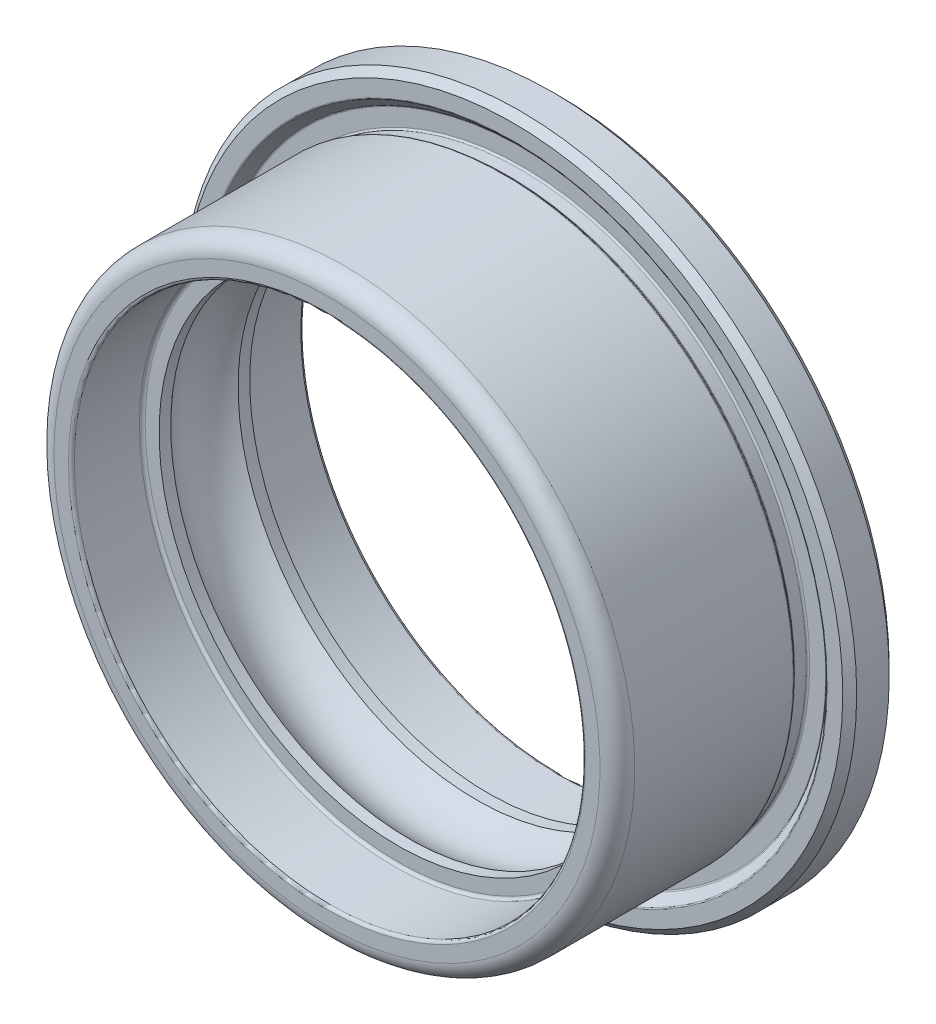
ISO-10303-21;
HEADER;
FILE_DESCRIPTION(('STEP AP214'),'2;1');
FILE_NAME('part.step','',(''),(''),'','','');
FILE_SCHEMA(('AUTOMOTIVE_DESIGN { 1 0 10303 214 1 1 1 1 }'));
ENDSEC;
DATA;
#1=APPLICATION_CONTEXT('core data for automotive mechanical design processes');
#2=APPLICATION_PROTOCOL_DEFINITION('international standard','automotive_design',2000,#1);
#3=PRODUCT_CONTEXT('',#1,'mechanical');
#4=PRODUCT('Part','Part','',(#3));
#5=PRODUCT_RELATED_PRODUCT_CATEGORY('part','',(#4));
#6=PRODUCT_DEFINITION_FORMATION('','',#4);
#7=PRODUCT_DEFINITION_CONTEXT('part definition',#1,'design');
#8=PRODUCT_DEFINITION('design','',#6,#7);
#9=PRODUCT_DEFINITION_SHAPE('','',#8);
#10=(LENGTH_UNIT() NAMED_UNIT(*) SI_UNIT(.MILLI.,.METRE.));
#11=(NAMED_UNIT(*) PLANE_ANGLE_UNIT() SI_UNIT($,.RADIAN.));
#12=(NAMED_UNIT(*) SI_UNIT($,.STERADIAN.) SOLID_ANGLE_UNIT());
#13=UNCERTAINTY_MEASURE_WITH_UNIT(LENGTH_MEASURE(1.E-05),#10,'distance_accuracy_value','');
#14=(GEOMETRIC_REPRESENTATION_CONTEXT(3) GLOBAL_UNCERTAINTY_ASSIGNED_CONTEXT((#13)) GLOBAL_UNIT_ASSIGNED_CONTEXT((#10,
#11,#12)) REPRESENTATION_CONTEXT('',''));
#15=CARTESIAN_POINT('',(0.,0.,0.));
#16=DIRECTION('',(0.,0.,1.));
#17=DIRECTION('',(1.,0.,0.));
#18=AXIS2_PLACEMENT_3D('',#15,#16,#17);
#19=CARTESIAN_POINT('',(0.,0.,2.));
#20=DIRECTION('',(0.,0.,1.));
#21=DIRECTION('',(1.,0.,0.));
#22=AXIS2_PLACEMENT_3D('',#19,#20,#21);
#23=CYLINDRICAL_SURFACE('',#22,5.);
#24=CARTESIAN_POINT('',(0.,0.,-1.02757359312881));
#25=DIRECTION('',(0.,0.,-1.));
#26=DIRECTION('',(-1.,0.,0.));
#27=AXIS2_PLACEMENT_3D('',#24,#25,#26);
#28=CIRCLE('',#27,5.);
#29=CARTESIAN_POINT('',(-5.,0.,-1.02757359312881));
#30=VERTEX_POINT('',#29);
#31=EDGE_CURVE('E77',#30,#30,#28,.F.);
#32=ORIENTED_EDGE('',*,*,#31,.T.);
#33=EDGE_LOOP('',(#32));
#34=FACE_BOUND('',#33,.T.);
#35=CARTESIAN_POINT('',(0.,0.,1.7));
#36=DIRECTION('',(0.,0.,-1.));
#37=DIRECTION('',(-1.,0.,0.));
#38=AXIS2_PLACEMENT_3D('',#35,#36,#37);
#39=CIRCLE('',#38,5.);
#40=CARTESIAN_POINT('',(-5.,0.,1.7));
#41=VERTEX_POINT('',#40);
#42=EDGE_CURVE('E113',#41,#41,#39,.T.);
#43=ORIENTED_EDGE('',*,*,#42,.T.);
#44=EDGE_LOOP('',(#43));
#45=FACE_BOUND('',#44,.T.);
#46=ADVANCED_FACE('F39',(#34,#45),#23,.T.);
#47=CARTESIAN_POINT('',(0.,0.,2.));
#48=DIRECTION('',(0.,0.,1.));
#49=DIRECTION('',(1.,0.,0.));
#50=AXIS2_PLACEMENT_3D('',#47,#48,#49);
#51=CYLINDRICAL_SURFACE('',#50,4.4);
#52=CARTESIAN_POINT('',(0.,0.,1.95));
#53=DIRECTION('',(0.,0.,-1.));
#54=DIRECTION('',(-1.,0.,0.));
#55=AXIS2_PLACEMENT_3D('',#52,#53,#54);
#56=CIRCLE('',#55,4.4);
#57=CARTESIAN_POINT('',(-4.4,0.,1.95));
#58=VERTEX_POINT('',#57);
#59=EDGE_CURVE('E95',#58,#58,#56,.F.);
#60=ORIENTED_EDGE('',*,*,#59,.T.);
#61=EDGE_LOOP('',(#60));
#62=FACE_BOUND('',#61,.T.);
#63=CARTESIAN_POINT('',(0.,0.,0.829992845424422));
#64=DIRECTION('',(0.,0.,-1.));
#65=DIRECTION('',(-1.,0.,0.));
#66=AXIS2_PLACEMENT_3D('',#63,#64,#65);
#67=CIRCLE('',#66,4.4);
#68=CARTESIAN_POINT('',(-4.4,0.,0.829992845424422));
#69=VERTEX_POINT('',#68);
#70=EDGE_CURVE('E98',#69,#69,#67,.T.);
#71=ORIENTED_EDGE('',*,*,#70,.T.);
#72=EDGE_LOOP('',(#71));
#73=FACE_BOUND('',#72,.T.);
#74=ADVANCED_FACE('F154',(#62,#73),#51,.F.);
#75=CARTESIAN_POINT('',(0.,4.4,0.779992845424422));
#76=DIRECTION('',(0.,0.,-1.));
#77=DIRECTION('',(-1.,0.,0.));
#78=AXIS2_PLACEMENT_3D('',#75,#76,#77);
#79=PLANE('',#78);
#80=CARTESIAN_POINT('',(0.,0.,0.779992845424422));
#81=DIRECTION('',(0.,0.,-1.));
#82=DIRECTION('',(-1.,0.,0.));
#83=AXIS2_PLACEMENT_3D('',#80,#81,#82);
#84=CIRCLE('',#83,4.35);
#85=CARTESIAN_POINT('',(-4.35,0.,0.779992845424422));
#86=VERTEX_POINT('',#85);
#87=EDGE_CURVE('E89',#86,#86,#84,.F.);
#88=ORIENTED_EDGE('',*,*,#87,.T.);
#89=EDGE_LOOP('',(#88));
#90=FACE_BOUND('',#89,.T.);
#91=CARTESIAN_POINT('',(0.,0.,0.779992845424422));
#92=DIRECTION('',(0.,0.,1.));
#93=DIRECTION('',(1.,0.,0.));
#94=AXIS2_PLACEMENT_3D('',#91,#92,#93);
#95=CIRCLE('',#94,4.11);
#96=CARTESIAN_POINT('',(4.11,0.,0.779992845424422));
#97=VERTEX_POINT('',#96);
#98=EDGE_CURVE('E119',#97,#97,#95,.T.);
#99=ORIENTED_EDGE('',*,*,#98,.F.);
#100=EDGE_LOOP('',(#99));
#101=FACE_BOUND('',#100,.T.);
#102=ADVANCED_FACE('F149',(#90,#101),#79,.F.);
#103=CARTESIAN_POINT('',(0.,0.,2.));
#104=DIRECTION('',(0.,0.,1.));
#105=DIRECTION('',(1.,0.,0.));
#106=AXIS2_PLACEMENT_3D('',#103,#104,#105);
#107=CYLINDRICAL_SURFACE('',#106,4.11);
#108=CARTESIAN_POINT('',(0.,0.,0.579992845424422));
#109=DIRECTION('',(0.,0.,1.));
#110=DIRECTION('',(1.,0.,0.));
#111=AXIS2_PLACEMENT_3D('',#108,#109,#110);
#112=CIRCLE('',#111,4.11);
#113=CARTESIAN_POINT('',(4.11,0.,0.579992845424422));
#114=VERTEX_POINT('',#113);
#115=EDGE_CURVE('E122',#114,#114,#112,.T.);
#116=ORIENTED_EDGE('',*,*,#115,.F.);
#117=EDGE_LOOP('',(#116));
#118=FACE_BOUND('',#117,.T.);
#119=ORIENTED_EDGE('',*,*,#98,.T.);
#120=EDGE_LOOP('',(#119));
#121=FACE_BOUND('',#120,.T.);
#122=ADVANCED_FACE('F143',(#118,#121),#107,.F.);
#123=CARTESIAN_POINT('',(0.,0.,0.));
#124=DIRECTION('',(0.,0.,1.));
#125=DIRECTION('',(1.,0.,0.));
#126=AXIS2_PLACEMENT_3D('',#123,#124,#125);
#127=TOROIDAL_SURFACE('',#126,3.52469298717982,0.824);
#128=CARTESIAN_POINT('',(0.,0.,-0.579992845424423));
#129=DIRECTION('',(0.,0.,1.));
#130=DIRECTION('',(1.,0.,0.));
#131=AXIS2_PLACEMENT_3D('',#128,#129,#130);
#132=CIRCLE('',#131,4.11);
#133=CARTESIAN_POINT('',(4.11,0.,-0.579992845424423));
#134=VERTEX_POINT('',#133);
#135=EDGE_CURVE('E125',#134,#134,#132,.T.);
#136=ORIENTED_EDGE('',*,*,#135,.F.);
#137=EDGE_LOOP('',(#136));
#138=FACE_BOUND('',#137,.T.);
#139=ORIENTED_EDGE('',*,*,#115,.T.);
#140=EDGE_LOOP('',(#139));
#141=FACE_BOUND('',#140,.T.);
#142=ADVANCED_FACE('F137',(#138,#141),#127,.F.);
#143=CARTESIAN_POINT('',(0.,0.,2.));
#144=DIRECTION('',(0.,0.,1.));
#145=DIRECTION('',(1.,0.,0.));
#146=AXIS2_PLACEMENT_3D('',#143,#144,#145);
#147=CYLINDRICAL_SURFACE('',#146,4.11);
#148=CARTESIAN_POINT('',(0.,0.,-0.779992845424422));
#149=DIRECTION('',(0.,0.,1.));
#150=DIRECTION('',(1.,0.,0.));
#151=AXIS2_PLACEMENT_3D('',#148,#149,#150);
#152=CIRCLE('',#151,4.11);
#153=CARTESIAN_POINT('',(4.11,0.,-0.779992845424422));
#154=VERTEX_POINT('',#153);
#155=EDGE_CURVE('E128',#154,#154,#152,.T.);
#156=ORIENTED_EDGE('',*,*,#155,.F.);
#157=EDGE_LOOP('',(#156));
#158=FACE_BOUND('',#157,.T.);
#159=ORIENTED_EDGE('',*,*,#135,.T.);
#160=EDGE_LOOP('',(#159));
#161=FACE_BOUND('',#160,.T.);
#162=ADVANCED_FACE('F134',(#158,#161),#147,.F.);
#163=CARTESIAN_POINT('',(0.,4.4,-0.779992845424422));
#164=DIRECTION('',(0.,0.,1.));
#165=DIRECTION('',(1.,0.,0.));
#166=AXIS2_PLACEMENT_3D('',#163,#164,#165);
#167=PLANE('',#166);
#168=CARTESIAN_POINT('',(0.,0.,-0.779992845424422));
#169=DIRECTION('',(0.,0.,1.));
#170=DIRECTION('',(1.,0.,0.));
#171=AXIS2_PLACEMENT_3D('',#168,#169,#170);
#172=CIRCLE('',#171,4.35);
#173=CARTESIAN_POINT('',(4.35,0.,-0.779992845424422));
#174=VERTEX_POINT('',#173);
#175=EDGE_CURVE('E101',#174,#174,#172,.F.);
#176=ORIENTED_EDGE('',*,*,#175,.T.);
#177=EDGE_LOOP('',(#176));
#178=FACE_BOUND('',#177,.T.);
#179=ORIENTED_EDGE('',*,*,#155,.T.);
#180=EDGE_LOOP('',(#179));
#181=FACE_BOUND('',#180,.T.);
#182=ADVANCED_FACE('F132',(#178,#181),#167,.F.);
#183=CARTESIAN_POINT('',(0.,0.,2.));
#184=DIRECTION('',(0.,0.,1.));
#185=DIRECTION('',(1.,0.,0.));
#186=AXIS2_PLACEMENT_3D('',#183,#184,#185);
#187=CYLINDRICAL_SURFACE('',#186,4.4);
#188=CARTESIAN_POINT('',(0.,0.,-1.95));
#189=DIRECTION('',(0.,0.,1.));
#190=DIRECTION('',(1.,0.,0.));
#191=AXIS2_PLACEMENT_3D('',#188,#189,#190);
#192=CIRCLE('',#191,4.4);
#193=CARTESIAN_POINT('',(4.4,0.,-1.95));
#194=VERTEX_POINT('',#193);
#195=EDGE_CURVE('E104',#194,#194,#192,.F.);
#196=ORIENTED_EDGE('',*,*,#195,.T.);
#197=EDGE_LOOP('',(#196));
#198=FACE_BOUND('',#197,.T.);
#199=CARTESIAN_POINT('',(0.,0.,-0.829992845424422));
#200=DIRECTION('',(0.,0.,1.));
#201=DIRECTION('',(1.,0.,0.));
#202=AXIS2_PLACEMENT_3D('',#199,#200,#201);
#203=CIRCLE('',#202,4.4);
#204=CARTESIAN_POINT('',(4.4,0.,-0.829992845424422));
#205=VERTEX_POINT('',#204);
#206=EDGE_CURVE('E107',#205,#205,#203,.T.);
#207=ORIENTED_EDGE('',*,*,#206,.T.);
#208=EDGE_LOOP('',(#207));
#209=FACE_BOUND('',#208,.T.);
#210=ADVANCED_FACE('F177',(#198,#209),#187,.F.);
#211=CARTESIAN_POINT('',(0.,5.,-2.));
#212=DIRECTION('',(0.,0.,1.));
#213=DIRECTION('',(1.,0.,0.));
#214=AXIS2_PLACEMENT_3D('',#211,#212,#213);
#215=PLANE('',#214);
#216=CARTESIAN_POINT('',(0.,0.,-2.));
#217=DIRECTION('',(0.,0.,1.));
#218=DIRECTION('',(1.,0.,0.));
#219=AXIS2_PLACEMENT_3D('',#216,#217,#218);
#220=CIRCLE('',#219,5.68);
#221=CARTESIAN_POINT('',(5.68,0.,-2.));
#222=VERTEX_POINT('',#221);
#223=EDGE_CURVE('E54',#222,#222,#220,.F.);
#224=ORIENTED_EDGE('',*,*,#223,.T.);
#225=EDGE_LOOP('',(#224));
#226=FACE_BOUND('',#225,.T.);
#227=CARTESIAN_POINT('',(0.,0.,-2.));
#228=DIRECTION('',(0.,0.,1.));
#229=DIRECTION('',(1.,0.,0.));
#230=AXIS2_PLACEMENT_3D('',#227,#228,#229);
#231=CIRCLE('',#230,4.45);
#232=CARTESIAN_POINT('',(4.45,0.,-2.));
#233=VERTEX_POINT('',#232);
#234=EDGE_CURVE('E110',#233,#233,#231,.T.);
#235=ORIENTED_EDGE('',*,*,#234,.T.);
#236=EDGE_LOOP('',(#235));
#237=FACE_BOUND('',#236,.T.);
#238=ADVANCED_FACE('F174',(#226,#237),#215,.F.);
#239=CARTESIAN_POINT('',(0.,5.,2.));
#240=DIRECTION('',(0.,0.,-1.));
#241=DIRECTION('',(-1.,0.,0.));
#242=AXIS2_PLACEMENT_3D('',#239,#240,#241);
#243=PLANE('',#242);
#244=CARTESIAN_POINT('',(0.,0.,2.));
#245=DIRECTION('',(0.,0.,-1.));
#246=DIRECTION('',(-1.,0.,0.));
#247=AXIS2_PLACEMENT_3D('',#244,#245,#246);
#248=CIRCLE('',#247,4.45);
#249=CARTESIAN_POINT('',(-4.45,0.,2.));
#250=VERTEX_POINT('',#249);
#251=EDGE_CURVE('E92',#250,#250,#248,.T.);
#252=ORIENTED_EDGE('',*,*,#251,.T.);
#253=EDGE_LOOP('',(#252));
#254=FACE_BOUND('',#253,.T.);
#255=CARTESIAN_POINT('',(0.,0.,2.));
#256=DIRECTION('',(0.,0.,-1.));
#257=DIRECTION('',(-1.,0.,0.));
#258=AXIS2_PLACEMENT_3D('',#255,#256,#257);
#259=CIRCLE('',#258,4.7);
#260=CARTESIAN_POINT('',(-4.7,0.,2.));
#261=VERTEX_POINT('',#260);
#262=EDGE_CURVE('E116',#261,#261,#259,.F.);
#263=ORIENTED_EDGE('',*,*,#262,.T.);
#264=EDGE_LOOP('',(#263));
#265=FACE_BOUND('',#264,.T.);
#266=ADVANCED_FACE('F172',(#254,#265),#243,.F.);
#267=CARTESIAN_POINT('',(0.,5.8,-1.2));
#268=DIRECTION('',(0.,0.,1.));
#269=DIRECTION('',(1.,0.,0.));
#270=AXIS2_PLACEMENT_3D('',#267,#268,#269);
#271=PLANE('',#270);
#272=CARTESIAN_POINT('',(0.,0.,-1.2));
#273=DIRECTION('',(0.,0.,1.));
#274=DIRECTION('',(1.,0.,0.));
#275=AXIS2_PLACEMENT_3D('',#272,#273,#274);
#276=CIRCLE('',#275,5.68);
#277=CARTESIAN_POINT('',(5.68,0.,-1.2));
#278=VERTEX_POINT('',#277);
#279=EDGE_CURVE('E10',#278,#278,#276,.T.);
#280=ORIENTED_EDGE('',*,*,#279,.T.);
#281=EDGE_LOOP('',(#280));
#282=FACE_BOUND('',#281,.T.);
#283=CARTESIAN_POINT('',(0.,0.,-1.2));
#284=DIRECTION('',(0.,0.,1.));
#285=DIRECTION('',(1.,0.,0.));
#286=AXIS2_PLACEMENT_3D('',#283,#284,#285);
#287=CIRCLE('',#286,5.41242640687119);
#288=CARTESIAN_POINT('',(5.41242640687119,0.,-1.2));
#289=VERTEX_POINT('',#288);
#290=EDGE_CURVE('E80',#289,#289,#287,.F.);
#291=ORIENTED_EDGE('',*,*,#290,.T.);
#292=EDGE_LOOP('',(#291));
#293=FACE_BOUND('',#292,.T.);
#294=ADVANCED_FACE('F255',(#282,#293),#271,.T.);
#295=CARTESIAN_POINT('',(0.,0.,-2.));
#296=DIRECTION('',(0.,0.,-1.));
#297=DIRECTION('',(-1.,0.,0.));
#298=AXIS2_PLACEMENT_3D('',#295,#296,#297);
#299=CYLINDRICAL_SURFACE('',#298,5.8);
#300=CARTESIAN_POINT('',(0.,0.,-1.88));
#301=DIRECTION('',(0.,0.,1.));
#302=DIRECTION('',(1.,0.,0.));
#303=AXIS2_PLACEMENT_3D('',#300,#301,#302);
#304=CIRCLE('',#303,5.8);
#305=CARTESIAN_POINT('',(5.8,0.,-1.88));
#306=VERTEX_POINT('',#305);
#307=EDGE_CURVE('E46',#306,#306,#304,.T.);
#308=ORIENTED_EDGE('',*,*,#307,.T.);
#309=EDGE_LOOP('',(#308));
#310=FACE_BOUND('',#309,.T.);
#311=CARTESIAN_POINT('',(0.,0.,-1.32));
#312=DIRECTION('',(0.,0.,1.));
#313=DIRECTION('',(1.,0.,0.));
#314=AXIS2_PLACEMENT_3D('',#311,#312,#313);
#315=CIRCLE('',#314,5.8);
#316=CARTESIAN_POINT('',(5.8,0.,-1.32));
#317=VERTEX_POINT('',#316);
#318=EDGE_CURVE('E50',#317,#317,#315,.F.);
#319=ORIENTED_EDGE('',*,*,#318,.T.);
#320=EDGE_LOOP('',(#319));
#321=FACE_BOUND('',#320,.T.);
#322=ADVANCED_FACE('F253',(#310,#321),#299,.T.);
#323=CARTESIAN_POINT('',(0.,0.,1.7));
#324=DIRECTION('',(0.,0.,-1.));
#325=DIRECTION('',(-1.,0.,0.));
#326=AXIS2_PLACEMENT_3D('',#323,#324,#325);
#327=TOROIDAL_SURFACE('',#326,4.7,0.3);
#328=ORIENTED_EDGE('',*,*,#42,.F.);
#329=EDGE_LOOP('',(#328));
#330=FACE_BOUND('',#329,.T.);
#331=ORIENTED_EDGE('',*,*,#262,.F.);
#332=EDGE_LOOP('',(#331));
#333=FACE_BOUND('',#332,.T.);
#334=ADVANCED_FACE('F205',(#330,#333),#327,.T.);
#335=CARTESIAN_POINT('',(0.,0.,-1.95));
#336=DIRECTION('',(0.,0.,1.));
#337=DIRECTION('',(1.,0.,0.));
#338=AXIS2_PLACEMENT_3D('',#335,#336,#337);
#339=TOROIDAL_SURFACE('',#338,4.45,0.05);
#340=ORIENTED_EDGE('',*,*,#195,.F.);
#341=EDGE_LOOP('',(#340));
#342=FACE_BOUND('',#341,.T.);
#343=ORIENTED_EDGE('',*,*,#234,.F.);
#344=EDGE_LOOP('',(#343));
#345=FACE_BOUND('',#344,.T.);
#346=ADVANCED_FACE('F193',(#342,#345),#339,.T.);
#347=CARTESIAN_POINT('',(0.,0.,-0.829992845424422));
#348=DIRECTION('',(0.,0.,1.));
#349=DIRECTION('',(1.,0.,0.));
#350=AXIS2_PLACEMENT_3D('',#347,#348,#349);
#351=TOROIDAL_SURFACE('',#350,4.35,0.05);
#352=ORIENTED_EDGE('',*,*,#175,.F.);
#353=EDGE_LOOP('',(#352));
#354=FACE_BOUND('',#353,.T.);
#355=ORIENTED_EDGE('',*,*,#206,.F.);
#356=EDGE_LOOP('',(#355));
#357=FACE_BOUND('',#356,.T.);
#358=ADVANCED_FACE('F189',(#354,#357),#351,.F.);
#359=CARTESIAN_POINT('',(0.,0.,1.95));
#360=DIRECTION('',(0.,0.,-1.));
#361=DIRECTION('',(-1.,0.,0.));
#362=AXIS2_PLACEMENT_3D('',#359,#360,#361);
#363=TOROIDAL_SURFACE('',#362,4.45,0.05);
#364=ORIENTED_EDGE('',*,*,#251,.F.);
#365=EDGE_LOOP('',(#364));
#366=FACE_BOUND('',#365,.T.);
#367=ORIENTED_EDGE('',*,*,#59,.F.);
#368=EDGE_LOOP('',(#367));
#369=FACE_BOUND('',#368,.T.);
#370=ADVANCED_FACE('F192',(#366,#369),#363,.T.);
#371=CARTESIAN_POINT('',(0.,0.,0.829992845424422));
#372=DIRECTION('',(0.,0.,-1.));
#373=DIRECTION('',(-1.,0.,0.));
#374=AXIS2_PLACEMENT_3D('',#371,#372,#373);
#375=TOROIDAL_SURFACE('',#374,4.35,0.05);
#376=ORIENTED_EDGE('',*,*,#70,.F.);
#377=EDGE_LOOP('',(#376));
#378=FACE_BOUND('',#377,.T.);
#379=ORIENTED_EDGE('',*,*,#87,.F.);
#380=EDGE_LOOP('',(#379));
#381=FACE_BOUND('',#380,.T.);
#382=ADVANCED_FACE('F202',(#378,#381),#375,.F.);
#383=CARTESIAN_POINT('',(0.,0.,-1.04));
#384=DIRECTION('',(0.,0.,1.));
#385=DIRECTION('',(1.,0.,0.));
#386=AXIS2_PLACEMENT_3D('',#383,#384,#385);
#387=CONICAL_SURFACE('',#386,5.,0.785398163397443);
#388=CARTESIAN_POINT('',(0.,0.,-1.0487867965644));
#389=DIRECTION('',(0.,0.,1.));
#390=DIRECTION('',(1.,0.,0.));
#391=AXIS2_PLACEMENT_3D('',#388,#389,#390);
#392=CIRCLE('',#391,4.9912132034356);
#393=CARTESIAN_POINT('',(4.9912132034356,0.,-1.0487867965644));
#394=VERTEX_POINT('',#393);
#395=EDGE_CURVE('E71',#394,#394,#392,.F.);
#396=ORIENTED_EDGE('',*,*,#395,.T.);
#397=EDGE_LOOP('',(#396));
#398=FACE_BOUND('',#397,.T.);
#399=CARTESIAN_POINT('',(0.,0.,-1.1112132034356));
#400=DIRECTION('',(0.,0.,1.));
#401=DIRECTION('',(1.,0.,0.));
#402=AXIS2_PLACEMENT_3D('',#399,#400,#401);
#403=CIRCLE('',#402,4.92878679656441);
#404=CARTESIAN_POINT('',(4.92878679656441,0.,-1.1112132034356));
#405=VERTEX_POINT('',#404);
#406=EDGE_CURVE('E74',#405,#405,#403,.T.);
#407=ORIENTED_EDGE('',*,*,#406,.T.);
#408=EDGE_LOOP('',(#407));
#409=FACE_BOUND('',#408,.T.);
#410=ADVANCED_FACE('F212',(#398,#409),#387,.T.);
#411=CARTESIAN_POINT('',(0.,0.,2.));
#412=DIRECTION('',(0.,0.,1.));
#413=DIRECTION('',(1.,0.,0.));
#414=AXIS2_PLACEMENT_3D('',#411,#412,#413);
#415=CYLINDRICAL_SURFACE('',#414,4.92);
#416=CARTESIAN_POINT('',(0.,0.,-1.13242640687119));
#417=DIRECTION('',(0.,0.,1.));
#418=DIRECTION('',(1.,0.,0.));
#419=AXIS2_PLACEMENT_3D('',#416,#417,#418);
#420=CIRCLE('',#419,4.92);
#421=CARTESIAN_POINT('',(4.92,0.,-1.13242640687119));
#422=VERTEX_POINT('',#421);
#423=EDGE_CURVE('E65',#422,#422,#420,.F.);
#424=ORIENTED_EDGE('',*,*,#423,.T.);
#425=EDGE_LOOP('',(#424));
#426=FACE_BOUND('',#425,.T.);
#427=CARTESIAN_POINT('',(0.,0.,-1.33));
#428=DIRECTION('',(0.,0.,1.));
#429=DIRECTION('',(1.,0.,0.));
#430=AXIS2_PLACEMENT_3D('',#427,#428,#429);
#431=CIRCLE('',#430,4.92);
#432=CARTESIAN_POINT('',(4.92,0.,-1.33));
#433=VERTEX_POINT('',#432);
#434=EDGE_CURVE('E68',#433,#433,#431,.T.);
#435=ORIENTED_EDGE('',*,*,#434,.T.);
#436=EDGE_LOOP('',(#435));
#437=FACE_BOUND('',#436,.T.);
#438=ADVANCED_FACE('F266',(#426,#437),#415,.T.);
#439=CARTESIAN_POINT('',(0.,5.24,-1.36));
#440=DIRECTION('',(0.,0.,1.));
#441=DIRECTION('',(1.,0.,0.));
#442=AXIS2_PLACEMENT_3D('',#439,#440,#441);
#443=PLANE('',#442);
#444=CARTESIAN_POINT('',(0.,0.,-1.36));
#445=DIRECTION('',(0.,0.,1.));
#446=DIRECTION('',(1.,0.,0.));
#447=AXIS2_PLACEMENT_3D('',#444,#445,#446);
#448=CIRCLE('',#447,4.95);
#449=CARTESIAN_POINT('',(4.95,0.,-1.36));
#450=VERTEX_POINT('',#449);
#451=EDGE_CURVE('E59',#450,#450,#448,.F.);
#452=ORIENTED_EDGE('',*,*,#451,.T.);
#453=EDGE_LOOP('',(#452));
#454=FACE_BOUND('',#453,.T.);
#455=CARTESIAN_POINT('',(0.,0.,-1.36));
#456=DIRECTION('',(0.,0.,1.));
#457=DIRECTION('',(1.,0.,0.));
#458=AXIS2_PLACEMENT_3D('',#455,#456,#457);
#459=CIRCLE('',#458,5.22757359312881);
#460=CARTESIAN_POINT('',(5.22757359312881,0.,-1.36));
#461=VERTEX_POINT('',#460);
#462=EDGE_CURVE('E62',#461,#461,#459,.T.);
#463=ORIENTED_EDGE('',*,*,#462,.T.);
#464=EDGE_LOOP('',(#463));
#465=FACE_BOUND('',#464,.T.);
#466=ADVANCED_FACE('F270',(#454,#465),#443,.T.);
#467=CARTESIAN_POINT('',(0.,0.,-1.36));
#468=DIRECTION('',(0.,0.,1.));
#469=DIRECTION('',(1.,0.,0.));
#470=AXIS2_PLACEMENT_3D('',#467,#468,#469);
#471=CONICAL_SURFACE('',#470,5.24,0.785398163397452);
#472=CARTESIAN_POINT('',(0.,0.,-1.2087867965644));
#473=DIRECTION('',(0.,0.,-1.));
#474=DIRECTION('',(-1.,0.,0.));
#475=AXIS2_PLACEMENT_3D('',#472,#473,#474);
#476=CIRCLE('',#475,5.3912132034356);
#477=CARTESIAN_POINT('',(-5.3912132034356,0.,-1.2087867965644));
#478=VERTEX_POINT('',#477);
#479=EDGE_CURVE('E83',#478,#478,#476,.F.);
#480=ORIENTED_EDGE('',*,*,#479,.T.);
#481=EDGE_LOOP('',(#480));
#482=FACE_BOUND('',#481,.T.);
#483=CARTESIAN_POINT('',(0.,0.,-1.3512132034356));
#484=DIRECTION('',(0.,0.,1.));
#485=DIRECTION('',(1.,0.,0.));
#486=AXIS2_PLACEMENT_3D('',#483,#484,#485);
#487=CIRCLE('',#486,5.2487867965644);
#488=CARTESIAN_POINT('',(5.2487867965644,0.,-1.3512132034356));
#489=VERTEX_POINT('',#488);
#490=EDGE_CURVE('E86',#489,#489,#487,.F.);
#491=ORIENTED_EDGE('',*,*,#490,.T.);
#492=EDGE_LOOP('',(#491));
#493=FACE_BOUND('',#492,.T.);
#494=ADVANCED_FACE('F218',(#482,#493),#471,.F.);
#495=CARTESIAN_POINT('',(0.,0.,-1.23));
#496=DIRECTION('',(0.,0.,1.));
#497=DIRECTION('',(1.,0.,0.));
#498=AXIS2_PLACEMENT_3D('',#495,#496,#497);
#499=TOROIDAL_SURFACE('',#498,5.41242640687119,0.03);
#500=ORIENTED_EDGE('',*,*,#290,.F.);
#501=EDGE_LOOP('',(#500));
#502=FACE_BOUND('',#501,.T.);
#503=ORIENTED_EDGE('',*,*,#479,.F.);
#504=EDGE_LOOP('',(#503));
#505=FACE_BOUND('',#504,.T.);
#506=ADVANCED_FACE('F214',(#502,#505),#499,.T.);
#507=CARTESIAN_POINT('',(0.,0.,-1.02757359312881));
#508=DIRECTION('',(0.,0.,-1.));
#509=DIRECTION('',(-1.,0.,0.));
#510=AXIS2_PLACEMENT_3D('',#507,#508,#509);
#511=TOROIDAL_SURFACE('',#510,4.97,0.03);
#512=ORIENTED_EDGE('',*,*,#395,.F.);
#513=EDGE_LOOP('',(#512));
#514=FACE_BOUND('',#513,.T.);
#515=ORIENTED_EDGE('',*,*,#31,.F.);
#516=EDGE_LOOP('',(#515));
#517=FACE_BOUND('',#516,.T.);
#518=ADVANCED_FACE('F217',(#514,#517),#511,.T.);
#519=CARTESIAN_POINT('',(0.,0.,-1.13242640687119));
#520=DIRECTION('',(0.,0.,1.));
#521=DIRECTION('',(1.,0.,0.));
#522=AXIS2_PLACEMENT_3D('',#519,#520,#521);
#523=TOROIDAL_SURFACE('',#522,4.95,0.03);
#524=ORIENTED_EDGE('',*,*,#423,.F.);
#525=EDGE_LOOP('',(#524));
#526=FACE_BOUND('',#525,.T.);
#527=ORIENTED_EDGE('',*,*,#406,.F.);
#528=EDGE_LOOP('',(#527));
#529=FACE_BOUND('',#528,.T.);
#530=ADVANCED_FACE('F222',(#526,#529),#523,.F.);
#531=CARTESIAN_POINT('',(0.,0.,-1.33));
#532=DIRECTION('',(0.,0.,1.));
#533=DIRECTION('',(1.,0.,0.));
#534=AXIS2_PLACEMENT_3D('',#531,#532,#533);
#535=TOROIDAL_SURFACE('',#534,4.95,0.03);
#536=ORIENTED_EDGE('',*,*,#451,.F.);
#537=EDGE_LOOP('',(#536));
#538=FACE_BOUND('',#537,.T.);
#539=ORIENTED_EDGE('',*,*,#434,.F.);
#540=EDGE_LOOP('',(#539));
#541=FACE_BOUND('',#540,.T.);
#542=ADVANCED_FACE('F226',(#538,#541),#535,.F.);
#543=CARTESIAN_POINT('',(0.,0.,-1.33));
#544=DIRECTION('',(0.,0.,1.));
#545=DIRECTION('',(1.,0.,0.));
#546=AXIS2_PLACEMENT_3D('',#543,#544,#545);
#547=TOROIDAL_SURFACE('',#546,5.22757359312881,0.03);
#548=ORIENTED_EDGE('',*,*,#490,.F.);
#549=EDGE_LOOP('',(#548));
#550=FACE_BOUND('',#549,.T.);
#551=ORIENTED_EDGE('',*,*,#462,.F.);
#552=EDGE_LOOP('',(#551));
#553=FACE_BOUND('',#552,.T.);
#554=ADVANCED_FACE('F230',(#550,#553),#547,.F.);
#555=CARTESIAN_POINT('',(0.,0.,-2.));
#556=DIRECTION('',(0.,0.,1.));
#557=DIRECTION('',(1.,0.,0.));
#558=AXIS2_PLACEMENT_3D('',#555,#556,#557);
#559=CONICAL_SURFACE('',#558,5.68,0.785398163397459);
#560=ORIENTED_EDGE('',*,*,#307,.F.);
#561=EDGE_LOOP('',(#560));
#562=FACE_BOUND('',#561,.T.);
#563=ORIENTED_EDGE('',*,*,#223,.F.);
#564=EDGE_LOOP('',(#563));
#565=FACE_BOUND('',#564,.T.);
#566=ADVANCED_FACE('F233',(#562,#565),#559,.T.);
#567=CARTESIAN_POINT('',(0.,0.,-1.32));
#568=DIRECTION('',(0.,0.,-1.));
#569=DIRECTION('',(-1.,0.,0.));
#570=AXIS2_PLACEMENT_3D('',#567,#568,#569);
#571=CONICAL_SURFACE('',#570,5.8,0.785398163397448);
#572=ORIENTED_EDGE('',*,*,#279,.F.);
#573=EDGE_LOOP('',(#572));
#574=FACE_BOUND('',#573,.T.);
#575=ORIENTED_EDGE('',*,*,#318,.F.);
#576=EDGE_LOOP('',(#575));
#577=FACE_BOUND('',#576,.T.);
#578=ADVANCED_FACE('F41',(#574,#577),#571,.T.);
#579=CLOSED_SHELL('',(#46,#74,#102,#122,#142,#162,#182,#210,#238,#266,#294,#322,#334,#346,#358,
#370,#382,#410,#438,#466,#494,#506,#518,#530,#542,#554,#566,#578));
#580=MANIFOLD_SOLID_BREP('B2',#579);
#581=ADVANCED_BREP_SHAPE_REPRESENTATION('',(#18,#580),#14);
#582=SHAPE_DEFINITION_REPRESENTATION(#9,#581);
ENDSEC;
END-ISO-10303-21;
